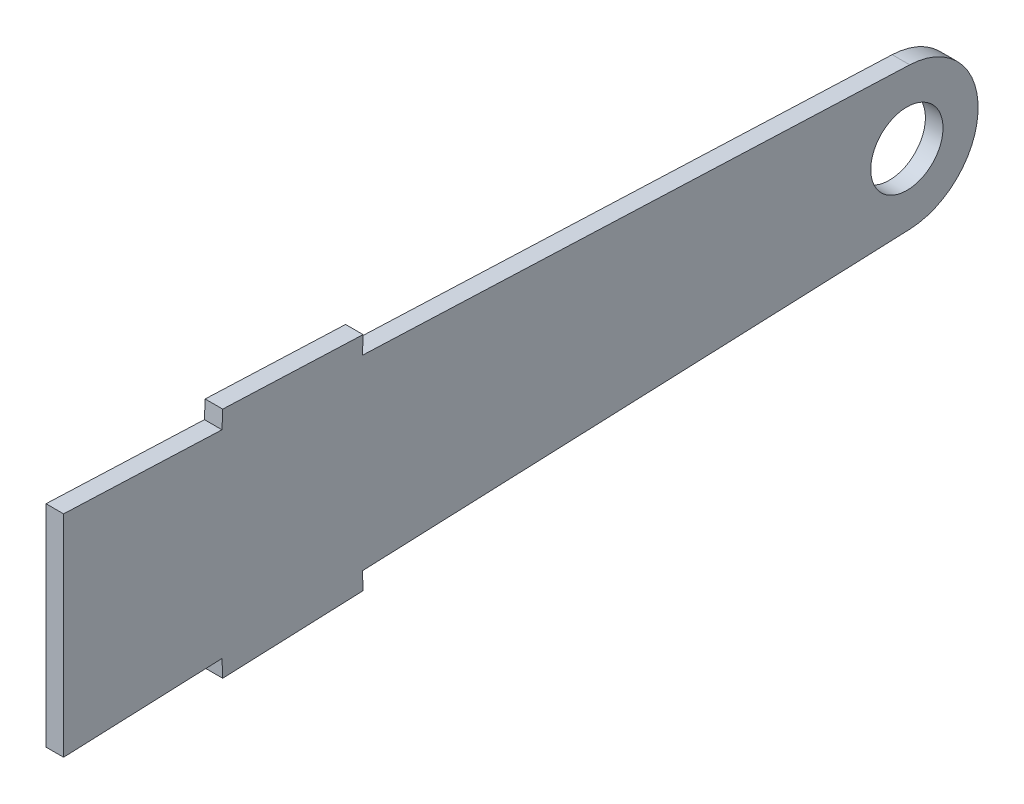
ISO-10303-21;
HEADER;
FILE_DESCRIPTION(('STEP AP214'),'2;1');
FILE_NAME('part.step','',(''),(''),'','','');
FILE_SCHEMA(('AUTOMOTIVE_DESIGN { 1 0 10303 214 1 1 1 1 }'));
ENDSEC;
DATA;
#1=APPLICATION_CONTEXT('core data for automotive mechanical design processes');
#2=APPLICATION_PROTOCOL_DEFINITION('international standard','automotive_design',2000,#1);
#3=PRODUCT_CONTEXT('',#1,'mechanical');
#4=PRODUCT('Part','Part','',(#3));
#5=PRODUCT_RELATED_PRODUCT_CATEGORY('part','',(#4));
#6=PRODUCT_DEFINITION_FORMATION('','',#4);
#7=PRODUCT_DEFINITION_CONTEXT('part definition',#1,'design');
#8=PRODUCT_DEFINITION('design','',#6,#7);
#9=PRODUCT_DEFINITION_SHAPE('','',#8);
#10=(LENGTH_UNIT() NAMED_UNIT(*) SI_UNIT(.MILLI.,.METRE.));
#11=(NAMED_UNIT(*) PLANE_ANGLE_UNIT() SI_UNIT($,.RADIAN.));
#12=(NAMED_UNIT(*) SI_UNIT($,.STERADIAN.) SOLID_ANGLE_UNIT());
#13=UNCERTAINTY_MEASURE_WITH_UNIT(LENGTH_MEASURE(1.E-05),#10,'distance_accuracy_value','');
#14=(GEOMETRIC_REPRESENTATION_CONTEXT(3) GLOBAL_UNCERTAINTY_ASSIGNED_CONTEXT((#13)) GLOBAL_UNIT_ASSIGNED_CONTEXT((#10,
#11,#12)) REPRESENTATION_CONTEXT('',''));
#15=CARTESIAN_POINT('',(0.,0.,0.));
#16=DIRECTION('',(0.,0.,1.));
#17=DIRECTION('',(1.,0.,0.));
#18=AXIS2_PLACEMENT_3D('',#15,#16,#17);
#19=CARTESIAN_POINT('',(0.79375,6.43364372806374,-0.260118416007961));
#20=DIRECTION('',(0.,-0.999183669270172,0.040397958658771));
#21=DIRECTION('',(0.,-0.040397958658771,-0.999183669270172));
#22=AXIS2_PLACEMENT_3D('',#19,#20,#21);
#23=PLANE('',#22);
#24=DIRECTION('',(-1.,0.,0.));
#25=VECTOR('',#24,1.);
#26=CARTESIAN_POINT('',(13.7191277549269,8.9462344460208,61.8850912998656));
#27=LINE('',#26,#25);
#28=CARTESIAN_POINT('',(0.793749999999999,8.9462344460208,61.8850912998656));
#29=VERTEX_POINT('',#28);
#30=CARTESIAN_POINT('',(-0.79375,8.9462344460208,61.8850912998656));
#31=VERTEX_POINT('',#30);
#32=EDGE_CURVE('E59',#29,#31,#27,.T.);
#33=ORIENTED_EDGE('',*,*,#32,.T.);
#34=DIRECTION('',(0.,0.040397958658771,0.999183669270172));
#35=VECTOR('',#34,1.);
#36=CARTESIAN_POINT('',(-0.79375,6.43364372806374,-0.260118416007961));
#37=LINE('',#36,#35);
#38=CARTESIAN_POINT('',(-0.79375,9.52499999999999,76.2));
#39=VERTEX_POINT('',#38);
#40=EDGE_CURVE('E187',#31,#39,#37,.T.);
#41=ORIENTED_EDGE('',*,*,#40,.T.);
#42=DIRECTION('',(-1.,0.,0.));
#43=VECTOR('',#42,1.);
#44=CARTESIAN_POINT('',(0.79375,9.52499999999999,76.2));
#45=LINE('',#44,#43);
#46=CARTESIAN_POINT('',(0.79375,9.52499999999999,76.2));
#47=VERTEX_POINT('',#46);
#48=EDGE_CURVE('E11',#47,#39,#45,.T.);
#49=ORIENTED_EDGE('',*,*,#48,.F.);
#50=DIRECTION('',(0.,0.040397958658771,0.999183669270172));
#51=VECTOR('',#50,1.);
#52=CARTESIAN_POINT('',(0.79375,6.43364372806374,-0.260118416007961));
#53=LINE('',#52,#51);
#54=EDGE_CURVE('E193',#29,#47,#53,.T.);
#55=ORIENTED_EDGE('',*,*,#54,.F.);
#56=EDGE_LOOP('',(#33,#41,#49,#55));
#57=FACE_BOUND('',#56,.T.);
#58=ADVANCED_FACE('F36',(#57),#23,.F.);
#59=CARTESIAN_POINT('',(0.79375,-6.43364372806371,-0.260118416007964));
#60=DIRECTION('',(0.,0.999183669270172,0.0403979586587716));
#61=DIRECTION('',(0.,-0.0403979586587716,0.999183669270172));
#62=AXIS2_PLACEMENT_3D('',#59,#60,#61);
#63=PLANE('',#62);
#64=DIRECTION('',(-1.,0.,0.));
#65=VECTOR('',#64,1.);
#66=CARTESIAN_POINT('',(13.7191277549269,-8.43318037105441,49.1954587001344));
#67=LINE('',#66,#65);
#68=CARTESIAN_POINT('',(0.793749999999999,-8.43318037105441,49.1954587001344));
#69=VERTEX_POINT('',#68);
#70=CARTESIAN_POINT('',(-0.79375,-8.43318037105441,49.1954587001344));
#71=VERTEX_POINT('',#70);
#72=EDGE_CURVE('E172',#69,#71,#67,.T.);
#73=ORIENTED_EDGE('',*,*,#72,.T.);
#74=DIRECTION('',(0.,0.0403979586587716,-0.999183669270172));
#75=VECTOR('',#74,1.);
#76=CARTESIAN_POINT('',(-0.79375,-6.43364372806371,-0.260118416007964));
#77=LINE('',#76,#75);
#78=CARTESIAN_POINT('',(-0.79375,-6.43364372806371,-0.260118416007964));
#79=VERTEX_POINT('',#78);
#80=EDGE_CURVE('E206',#71,#79,#77,.T.);
#81=ORIENTED_EDGE('',*,*,#80,.T.);
#82=DIRECTION('',(-1.,0.,0.));
#83=VECTOR('',#82,1.);
#84=CARTESIAN_POINT('',(0.79375,-6.43364372806371,-0.260118416007964));
#85=LINE('',#84,#83);
#86=CARTESIAN_POINT('',(0.79375,-6.43364372806371,-0.260118416007964));
#87=VERTEX_POINT('',#86);
#88=EDGE_CURVE('E214',#87,#79,#85,.T.);
#89=ORIENTED_EDGE('',*,*,#88,.F.);
#90=DIRECTION('',(0.,0.0403979586587716,-0.999183669270172));
#91=VECTOR('',#90,1.);
#92=CARTESIAN_POINT('',(0.79375,-6.43364372806371,-0.260118416007964));
#93=LINE('',#92,#91);
#94=EDGE_CURVE('E195',#69,#87,#93,.T.);
#95=ORIENTED_EDGE('',*,*,#94,.F.);
#96=EDGE_LOOP('',(#73,#81,#89,#95));
#97=FACE_BOUND('',#96,.T.);
#98=ADVANCED_FACE('F252',(#97),#63,.F.);
#99=CARTESIAN_POINT('',(0.79375,0.,0.));
#100=DIRECTION('',(1.,0.,0.));
#101=DIRECTION('',(0.,0.,-1.));
#102=AXIS2_PLACEMENT_3D('',#99,#100,#101);
#103=PLANE('',#102);
#104=CARTESIAN_POINT('',(0.79375,6.43364372806372,-0.260118416007963));
#105=VERTEX_POINT('',#104);
#106=CARTESIAN_POINT('',(0.79375,8.43318037105441,49.1954587001344));
#107=VERTEX_POINT('',#106);
#108=EDGE_CURVE('E190',#105,#107,#53,.T.);
#109=ORIENTED_EDGE('',*,*,#108,.T.);
#110=DIRECTION('',(0.,-0.999183669270172,0.04039795865877));
#111=VECTOR('',#110,1.);
#112=CARTESIAN_POINT('',(0.793749999999999,10.0193844460208,49.1313269407636));
#113=LINE('',#112,#111);
#114=CARTESIAN_POINT('',(0.793749999999999,10.0193844460208,49.1313269407636));
#115=VERTEX_POINT('',#114);
#116=EDGE_CURVE('E132',#115,#107,#113,.T.);
#117=ORIENTED_EDGE('',*,*,#116,.F.);
#118=DIRECTION('',(0.,-0.0403979586587715,-0.999183669270172));
#119=VECTOR('',#118,1.);
#120=CARTESIAN_POINT('',(0.793749999999999,10.5324385209872,61.8209595404948));
#121=LINE('',#120,#119);
#122=CARTESIAN_POINT('',(0.793749999999999,10.5324385209872,61.8209595404948));
#123=VERTEX_POINT('',#122);
#124=EDGE_CURVE('E126',#123,#115,#121,.T.);
#125=ORIENTED_EDGE('',*,*,#124,.F.);
#126=DIRECTION('',(0.,-0.999183669270172,0.04039795865877));
#127=VECTOR('',#126,1.);
#128=CARTESIAN_POINT('',(0.793749999999999,10.5324385209872,61.8209595404948));
#129=LINE('',#128,#127);
#130=EDGE_CURVE('E130',#123,#29,#129,.T.);
#131=ORIENTED_EDGE('',*,*,#130,.T.);
#132=ORIENTED_EDGE('',*,*,#54,.T.);
#133=DIRECTION('',(0.,-1.,0.));
#134=VECTOR('',#133,1.);
#135=CARTESIAN_POINT('',(0.79375,9.52499999999999,76.2));
#136=LINE('',#135,#134);
#137=CARTESIAN_POINT('',(0.79375,-9.52500000000001,76.2));
#138=VERTEX_POINT('',#137);
#139=EDGE_CURVE('E192',#47,#138,#136,.T.);
#140=ORIENTED_EDGE('',*,*,#139,.T.);
#141=CARTESIAN_POINT('',(0.79375,-8.94623444602081,61.8850912998656));
#142=VERTEX_POINT('',#141);
#143=EDGE_CURVE('E196',#138,#142,#93,.T.);
#144=ORIENTED_EDGE('',*,*,#143,.T.);
#145=DIRECTION('',(0.,0.999183669270172,0.04039795865877));
#146=VECTOR('',#145,1.);
#147=CARTESIAN_POINT('',(0.793749999999999,-10.5324385209872,61.8209595404948));
#148=LINE('',#147,#146);
#149=CARTESIAN_POINT('',(0.793749999999999,-10.5324385209872,61.8209595404948));
#150=VERTEX_POINT('',#149);
#151=EDGE_CURVE('E164',#150,#142,#148,.T.);
#152=ORIENTED_EDGE('',*,*,#151,.F.);
#153=DIRECTION('',(0.,0.0403979586587715,-0.999183669270172));
#154=VECTOR('',#153,1.);
#155=CARTESIAN_POINT('',(0.793749999999999,-10.5324385209872,61.8209595404948));
#156=LINE('',#155,#154);
#157=CARTESIAN_POINT('',(0.793749999999999,-10.0193844460208,49.1313269407636));
#158=VERTEX_POINT('',#157);
#159=EDGE_CURVE('E144',#150,#158,#156,.T.);
#160=ORIENTED_EDGE('',*,*,#159,.T.);
#161=DIRECTION('',(0.,0.999183669270172,0.04039795865877));
#162=VECTOR('',#161,1.);
#163=CARTESIAN_POINT('',(0.793749999999999,-10.0193844460208,49.1313269407636));
#164=LINE('',#163,#162);
#165=EDGE_CURVE('E173',#158,#69,#164,.T.);
#166=ORIENTED_EDGE('',*,*,#165,.T.);
#167=ORIENTED_EDGE('',*,*,#94,.T.);
#168=CARTESIAN_POINT('',(0.79375,0.,0.));
#169=DIRECTION('',(1.,0.,0.));
#170=DIRECTION('',(0.,0.,-1.));
#171=AXIS2_PLACEMENT_3D('',#168,#169,#170);
#172=CIRCLE('',#171,6.43890000000001);
#173=EDGE_CURVE('E199',#87,#105,#172,.T.);
#174=ORIENTED_EDGE('',*,*,#173,.T.);
#175=EDGE_LOOP('',(#109,#117,#125,#131,#132,#140,#144,#152,#160,#166,#167,#174));
#176=FACE_BOUND('',#175,.T.);
#177=CARTESIAN_POINT('',(0.79375,0.,0.));
#178=DIRECTION('',(1.,0.,0.));
#179=DIRECTION('',(0.,0.,-1.));
#180=AXIS2_PLACEMENT_3D('',#177,#178,#179);
#181=CIRCLE('',#180,3.2639);
#182=CARTESIAN_POINT('',(0.79375,0.,-3.2639));
#183=VERTEX_POINT('',#182);
#184=EDGE_CURVE('E184',#183,#183,#181,.T.);
#185=ORIENTED_EDGE('',*,*,#184,.F.);
#186=EDGE_LOOP('',(#185));
#187=FACE_BOUND('',#186,.T.);
#188=ADVANCED_FACE('F128',(#176,#187),#103,.T.);
#189=CARTESIAN_POINT('',(-0.79375,0.,0.));
#190=DIRECTION('',(1.,0.,0.));
#191=DIRECTION('',(0.,0.,-1.));
#192=AXIS2_PLACEMENT_3D('',#189,#190,#191);
#193=PLANE('',#192);
#194=CARTESIAN_POINT('',(-0.79375,6.43364372806372,-0.260118416007963));
#195=VERTEX_POINT('',#194);
#196=CARTESIAN_POINT('',(-0.79375,8.43318037105441,49.1954587001344));
#197=VERTEX_POINT('',#196);
#198=EDGE_CURVE('E202',#195,#197,#37,.T.);
#199=ORIENTED_EDGE('',*,*,#198,.F.);
#200=CARTESIAN_POINT('',(-0.79375,0.,0.));
#201=DIRECTION('',(1.,0.,0.));
#202=DIRECTION('',(0.,0.,-1.));
#203=AXIS2_PLACEMENT_3D('',#200,#201,#202);
#204=CIRCLE('',#203,6.43890000000001);
#205=EDGE_CURVE('E210',#79,#195,#204,.T.);
#206=ORIENTED_EDGE('',*,*,#205,.F.);
#207=ORIENTED_EDGE('',*,*,#80,.F.);
#208=DIRECTION('',(0.,0.999183669270172,0.04039795865877));
#209=VECTOR('',#208,1.);
#210=CARTESIAN_POINT('',(-0.79375,-10.0193844460208,49.1313269407636));
#211=LINE('',#210,#209);
#212=CARTESIAN_POINT('',(-0.79375,-10.0193844460208,49.1313269407636));
#213=VERTEX_POINT('',#212);
#214=EDGE_CURVE('E166',#213,#71,#211,.T.);
#215=ORIENTED_EDGE('',*,*,#214,.F.);
#216=DIRECTION('',(0.,0.0403979586587715,-0.999183669270172));
#217=VECTOR('',#216,1.);
#218=CARTESIAN_POINT('',(-0.79375,-10.5324385209872,61.8209595404948));
#219=LINE('',#218,#217);
#220=CARTESIAN_POINT('',(-0.79375,-10.5324385209872,61.8209595404948));
#221=VERTEX_POINT('',#220);
#222=EDGE_CURVE('E161',#221,#213,#219,.T.);
#223=ORIENTED_EDGE('',*,*,#222,.F.);
#224=DIRECTION('',(0.,0.999183669270172,0.04039795865877));
#225=VECTOR('',#224,1.);
#226=CARTESIAN_POINT('',(-0.79375,-10.5324385209872,61.8209595404948));
#227=LINE('',#226,#225);
#228=CARTESIAN_POINT('',(-0.79375,-8.94623444602081,61.8850912998656));
#229=VERTEX_POINT('',#228);
#230=EDGE_CURVE('E169',#221,#229,#227,.T.);
#231=ORIENTED_EDGE('',*,*,#230,.T.);
#232=CARTESIAN_POINT('',(-0.79375,-9.52500000000001,76.2));
#233=VERTEX_POINT('',#232);
#234=EDGE_CURVE('E207',#233,#229,#77,.T.);
#235=ORIENTED_EDGE('',*,*,#234,.F.);
#236=DIRECTION('',(0.,-1.,0.));
#237=VECTOR('',#236,1.);
#238=CARTESIAN_POINT('',(-0.79375,9.52499999999999,76.2));
#239=LINE('',#238,#237);
#240=EDGE_CURVE('E204',#39,#233,#239,.T.);
#241=ORIENTED_EDGE('',*,*,#240,.F.);
#242=ORIENTED_EDGE('',*,*,#40,.F.);
#243=DIRECTION('',(0.,-0.999183669270172,0.04039795865877));
#244=VECTOR('',#243,1.);
#245=CARTESIAN_POINT('',(-0.79375,10.5324385209872,61.8209595404948));
#246=LINE('',#245,#244);
#247=CARTESIAN_POINT('',(-0.79375,10.5324385209872,61.8209595404948));
#248=VERTEX_POINT('',#247);
#249=EDGE_CURVE('E150',#248,#31,#246,.T.);
#250=ORIENTED_EDGE('',*,*,#249,.F.);
#251=DIRECTION('',(0.,-0.0403979586587715,-0.999183669270172));
#252=VECTOR('',#251,1.);
#253=CARTESIAN_POINT('',(-0.79375,10.5324385209872,61.8209595404948));
#254=LINE('',#253,#252);
#255=CARTESIAN_POINT('',(-0.79375,10.0193844460208,49.1313269407636));
#256=VERTEX_POINT('',#255);
#257=EDGE_CURVE('E145',#248,#256,#254,.T.);
#258=ORIENTED_EDGE('',*,*,#257,.T.);
#259=DIRECTION('',(0.,-0.999183669270172,0.04039795865877));
#260=VECTOR('',#259,1.);
#261=CARTESIAN_POINT('',(-0.79375,10.0193844460208,49.1313269407636));
#262=LINE('',#261,#260);
#263=EDGE_CURVE('E136',#256,#197,#262,.T.);
#264=ORIENTED_EDGE('',*,*,#263,.T.);
#265=EDGE_LOOP('',(#199,#206,#207,#215,#223,#231,#235,#241,#242,#250,#258,#264));
#266=FACE_BOUND('',#265,.T.);
#267=CARTESIAN_POINT('',(-0.79375,0.,0.));
#268=DIRECTION('',(1.,0.,0.));
#269=DIRECTION('',(0.,0.,-1.));
#270=AXIS2_PLACEMENT_3D('',#267,#268,#269);
#271=CIRCLE('',#270,3.2639);
#272=CARTESIAN_POINT('',(-0.79375,0.,-3.2639));
#273=VERTEX_POINT('',#272);
#274=EDGE_CURVE('E183',#273,#273,#271,.T.);
#275=ORIENTED_EDGE('',*,*,#274,.T.);
#276=EDGE_LOOP('',(#275));
#277=FACE_BOUND('',#276,.T.);
#278=ADVANCED_FACE('F228',(#266,#277),#193,.F.);
#279=ORIENTED_EDGE('',*,*,#198,.T.);
#280=DIRECTION('',(-1.,0.,0.));
#281=VECTOR('',#280,1.);
#282=CARTESIAN_POINT('',(13.7191277549269,8.4331803710544,49.1954587001344));
#283=LINE('',#282,#281);
#284=EDGE_CURVE('E51',#107,#197,#283,.T.);
#285=ORIENTED_EDGE('',*,*,#284,.F.);
#286=ORIENTED_EDGE('',*,*,#108,.F.);
#287=DIRECTION('',(-1.,0.,0.));
#288=VECTOR('',#287,1.);
#289=CARTESIAN_POINT('',(0.79375,6.43364372806372,-0.260118416007963));
#290=LINE('',#289,#288);
#291=EDGE_CURVE('E201',#105,#195,#290,.T.);
#292=ORIENTED_EDGE('',*,*,#291,.T.);
#293=EDGE_LOOP('',(#279,#285,#286,#292));
#294=FACE_BOUND('',#293,.T.);
#295=ADVANCED_FACE('F38',(#294),#23,.F.);
#296=CARTESIAN_POINT('',(0.79375,9.52499999999999,76.2));
#297=DIRECTION('',(0.,0.,-1.));
#298=DIRECTION('',(-1.,0.,0.));
#299=AXIS2_PLACEMENT_3D('',#296,#297,#298);
#300=PLANE('',#299);
#301=ORIENTED_EDGE('',*,*,#240,.T.);
#302=DIRECTION('',(-1.,0.,0.));
#303=VECTOR('',#302,1.);
#304=CARTESIAN_POINT('',(0.79375,-9.52500000000001,76.2));
#305=LINE('',#304,#303);
#306=EDGE_CURVE('E44',#138,#233,#305,.T.);
#307=ORIENTED_EDGE('',*,*,#306,.F.);
#308=ORIENTED_EDGE('',*,*,#139,.F.);
#309=ORIENTED_EDGE('',*,*,#48,.T.);
#310=EDGE_LOOP('',(#301,#307,#308,#309));
#311=FACE_BOUND('',#310,.T.);
#312=ADVANCED_FACE('F238',(#311),#300,.F.);
#313=ORIENTED_EDGE('',*,*,#234,.T.);
#314=DIRECTION('',(-1.,0.,0.));
#315=VECTOR('',#314,1.);
#316=CARTESIAN_POINT('',(13.7191277549269,-8.94623444602081,61.8850912998656));
#317=LINE('',#316,#315);
#318=EDGE_CURVE('E175',#142,#229,#317,.T.);
#319=ORIENTED_EDGE('',*,*,#318,.F.);
#320=ORIENTED_EDGE('',*,*,#143,.F.);
#321=ORIENTED_EDGE('',*,*,#306,.T.);
#322=EDGE_LOOP('',(#313,#319,#320,#321));
#323=FACE_BOUND('',#322,.T.);
#324=ADVANCED_FACE('F221',(#323),#63,.F.);
#325=CARTESIAN_POINT('',(0.79375,0.,0.));
#326=DIRECTION('',(-1.,0.,0.));
#327=DIRECTION('',(0.,0.,1.));
#328=AXIS2_PLACEMENT_3D('',#325,#326,#327);
#329=CYLINDRICAL_SURFACE('',#328,6.43890000000001);
#330=ORIENTED_EDGE('',*,*,#205,.T.);
#331=ORIENTED_EDGE('',*,*,#291,.F.);
#332=ORIENTED_EDGE('',*,*,#173,.F.);
#333=ORIENTED_EDGE('',*,*,#88,.T.);
#334=EDGE_LOOP('',(#330,#331,#332,#333));
#335=FACE_BOUND('',#334,.T.);
#336=ADVANCED_FACE('F267',(#335),#329,.T.);
#337=CARTESIAN_POINT('',(0.79375,0.,0.));
#338=DIRECTION('',(-1.,0.,0.));
#339=DIRECTION('',(0.,0.,1.));
#340=AXIS2_PLACEMENT_3D('',#337,#338,#339);
#341=CYLINDRICAL_SURFACE('',#340,3.2639);
#342=ORIENTED_EDGE('',*,*,#184,.T.);
#343=EDGE_LOOP('',(#342));
#344=FACE_BOUND('',#343,.T.);
#345=ORIENTED_EDGE('',*,*,#274,.F.);
#346=EDGE_LOOP('',(#345));
#347=FACE_BOUND('',#346,.T.);
#348=ADVANCED_FACE('F285',(#344,#347),#341,.F.);
#349=CARTESIAN_POINT('',(13.7191277549269,-10.0193844460208,49.1313269407636));
#350=DIRECTION('',(0.,-0.04039795865877,0.999183669270172));
#351=DIRECTION('',(0.,-0.999183669270172,-0.04039795865877));
#352=AXIS2_PLACEMENT_3D('',#349,#350,#351);
#353=PLANE('',#352);
#354=ORIENTED_EDGE('',*,*,#165,.F.);
#355=DIRECTION('',(-1.,0.,0.));
#356=VECTOR('',#355,1.);
#357=CARTESIAN_POINT('',(13.7191277549269,-10.0193844460208,49.1313269407636));
#358=LINE('',#357,#356);
#359=EDGE_CURVE('E168',#158,#213,#358,.T.);
#360=ORIENTED_EDGE('',*,*,#359,.T.);
#361=ORIENTED_EDGE('',*,*,#214,.T.);
#362=ORIENTED_EDGE('',*,*,#72,.F.);
#363=EDGE_LOOP('',(#354,#360,#361,#362));
#364=FACE_BOUND('',#363,.T.);
#365=ADVANCED_FACE('F274',(#364),#353,.F.);
#366=CARTESIAN_POINT('',(13.7191277549269,-10.5324385209872,61.8209595404948));
#367=DIRECTION('',(0.,0.999183669270172,0.0403979586587715));
#368=DIRECTION('',(0.,-0.0403979586587715,0.999183669270172));
#369=AXIS2_PLACEMENT_3D('',#366,#367,#368);
#370=PLANE('',#369);
#371=ORIENTED_EDGE('',*,*,#159,.F.);
#372=DIRECTION('',(-1.,0.,0.));
#373=VECTOR('',#372,1.);
#374=CARTESIAN_POINT('',(13.7191277549269,-10.5324385209872,61.8209595404948));
#375=LINE('',#374,#373);
#376=EDGE_CURVE('E165',#150,#221,#375,.T.);
#377=ORIENTED_EDGE('',*,*,#376,.T.);
#378=ORIENTED_EDGE('',*,*,#222,.T.);
#379=ORIENTED_EDGE('',*,*,#359,.F.);
#380=EDGE_LOOP('',(#371,#377,#378,#379));
#381=FACE_BOUND('',#380,.T.);
#382=ADVANCED_FACE('F277',(#381),#370,.F.);
#383=CARTESIAN_POINT('',(13.7191277549269,-10.5324385209872,61.8209595404948));
#384=DIRECTION('',(0.,-0.04039795865877,0.999183669270172));
#385=DIRECTION('',(0.,-0.999183669270172,-0.04039795865877));
#386=AXIS2_PLACEMENT_3D('',#383,#384,#385);
#387=PLANE('',#386);
#388=ORIENTED_EDGE('',*,*,#376,.F.);
#389=ORIENTED_EDGE('',*,*,#151,.T.);
#390=ORIENTED_EDGE('',*,*,#318,.T.);
#391=ORIENTED_EDGE('',*,*,#230,.F.);
#392=EDGE_LOOP('',(#388,#389,#390,#391));
#393=FACE_BOUND('',#392,.T.);
#394=ADVANCED_FACE('F235',(#393),#387,.T.);
#395=CARTESIAN_POINT('',(13.7191277549269,10.5324385209872,61.8209595404948));
#396=DIRECTION('',(0.,0.999183669270172,-0.0403979586587715));
#397=DIRECTION('',(0.,0.0403979586587715,0.999183669270172));
#398=AXIS2_PLACEMENT_3D('',#395,#396,#397);
#399=PLANE('',#398);
#400=DIRECTION('',(-1.,0.,0.));
#401=VECTOR('',#400,1.);
#402=CARTESIAN_POINT('',(13.7191277549269,10.5324385209872,61.8209595404948));
#403=LINE('',#402,#401);
#404=EDGE_CURVE('E142',#123,#248,#403,.T.);
#405=ORIENTED_EDGE('',*,*,#404,.F.);
#406=ORIENTED_EDGE('',*,*,#124,.T.);
#407=DIRECTION('',(-1.,0.,0.));
#408=VECTOR('',#407,1.);
#409=CARTESIAN_POINT('',(13.7191277549269,10.0193844460208,49.1313269407636));
#410=LINE('',#409,#408);
#411=EDGE_CURVE('E137',#115,#256,#410,.T.);
#412=ORIENTED_EDGE('',*,*,#411,.T.);
#413=ORIENTED_EDGE('',*,*,#257,.F.);
#414=EDGE_LOOP('',(#405,#406,#412,#413));
#415=FACE_BOUND('',#414,.T.);
#416=ADVANCED_FACE('F148',(#415),#399,.T.);
#417=CARTESIAN_POINT('',(13.7191277549269,10.0193844460208,49.1313269407636));
#418=DIRECTION('',(0.,-0.04039795865877,-0.999183669270172));
#419=DIRECTION('',(0.,0.999183669270172,-0.04039795865877));
#420=AXIS2_PLACEMENT_3D('',#417,#418,#419);
#421=PLANE('',#420);
#422=ORIENTED_EDGE('',*,*,#411,.F.);
#423=ORIENTED_EDGE('',*,*,#116,.T.);
#424=ORIENTED_EDGE('',*,*,#284,.T.);
#425=ORIENTED_EDGE('',*,*,#263,.F.);
#426=EDGE_LOOP('',(#422,#423,#424,#425));
#427=FACE_BOUND('',#426,.T.);
#428=ADVANCED_FACE('F242',(#427),#421,.T.);
#429=CARTESIAN_POINT('',(13.7191277549269,10.5324385209872,61.8209595404948));
#430=DIRECTION('',(0.,-0.04039795865877,-0.999183669270172));
#431=DIRECTION('',(0.,0.999183669270172,-0.04039795865877));
#432=AXIS2_PLACEMENT_3D('',#429,#430,#431);
#433=PLANE('',#432);
#434=ORIENTED_EDGE('',*,*,#130,.F.);
#435=ORIENTED_EDGE('',*,*,#404,.T.);
#436=ORIENTED_EDGE('',*,*,#249,.T.);
#437=ORIENTED_EDGE('',*,*,#32,.F.);
#438=EDGE_LOOP('',(#434,#435,#436,#437));
#439=FACE_BOUND('',#438,.T.);
#440=ADVANCED_FACE('F140',(#439),#433,.F.);
#441=CLOSED_SHELL('',(#58,#98,#188,#278,#295,#312,#324,#336,#348,#365,#382,#394,#416,#428,#440));
#442=MANIFOLD_SOLID_BREP('B2',#441);
#443=ADVANCED_BREP_SHAPE_REPRESENTATION('',(#18,#442),#14);
#444=SHAPE_DEFINITION_REPRESENTATION(#9,#443);
ENDSEC;
END-ISO-10303-21;
